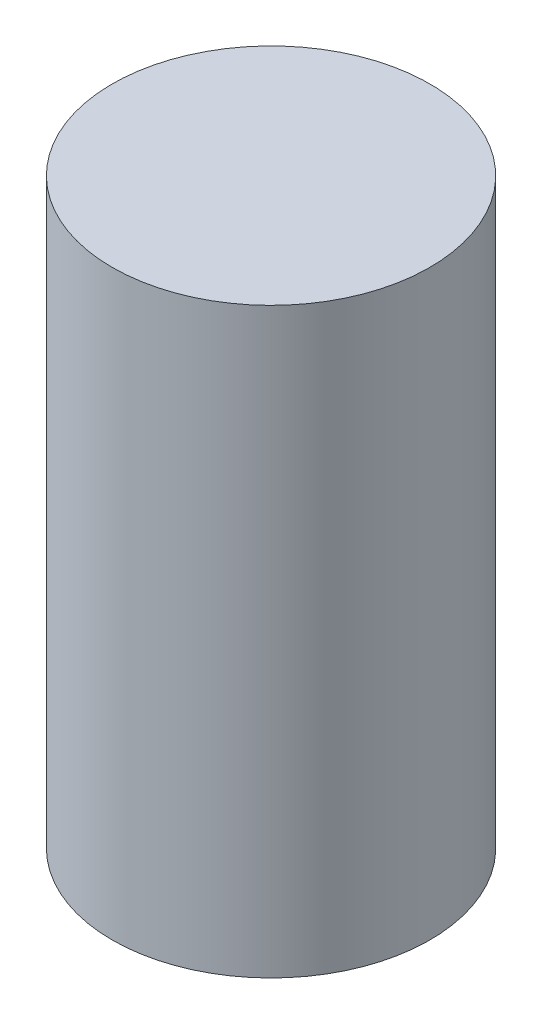
ISO-10303-21;
HEADER;
FILE_DESCRIPTION(('STEP AP214'),'2;1');
FILE_NAME('part.step','',(''),(''),'','','');
FILE_SCHEMA(('AUTOMOTIVE_DESIGN { 1 0 10303 214 1 1 1 1 }'));
ENDSEC;
DATA;
#1=APPLICATION_CONTEXT('core data for automotive mechanical design processes');
#2=APPLICATION_PROTOCOL_DEFINITION('international standard','automotive_design',2000,#1);
#3=PRODUCT_CONTEXT('',#1,'mechanical');
#4=PRODUCT('Part','Part','',(#3));
#5=PRODUCT_RELATED_PRODUCT_CATEGORY('part','',(#4));
#6=PRODUCT_DEFINITION_FORMATION('','',#4);
#7=PRODUCT_DEFINITION_CONTEXT('part definition',#1,'design');
#8=PRODUCT_DEFINITION('design','',#6,#7);
#9=PRODUCT_DEFINITION_SHAPE('','',#8);
#10=(LENGTH_UNIT() NAMED_UNIT(*) SI_UNIT(.MILLI.,.METRE.));
#11=(NAMED_UNIT(*) PLANE_ANGLE_UNIT() SI_UNIT($,.RADIAN.));
#12=(NAMED_UNIT(*) SI_UNIT($,.STERADIAN.) SOLID_ANGLE_UNIT());
#13=UNCERTAINTY_MEASURE_WITH_UNIT(LENGTH_MEASURE(1.E-05),#10,'distance_accuracy_value','');
#14=(GEOMETRIC_REPRESENTATION_CONTEXT(3) GLOBAL_UNCERTAINTY_ASSIGNED_CONTEXT((#13)) GLOBAL_UNIT_ASSIGNED_CONTEXT((#10,
#11,#12)) REPRESENTATION_CONTEXT('',''));
#15=CARTESIAN_POINT('',(0.,0.,0.));
#16=DIRECTION('',(0.,0.,1.));
#17=DIRECTION('',(1.,0.,0.));
#18=AXIS2_PLACEMENT_3D('',#15,#16,#17);
#19=CARTESIAN_POINT('',(0.,-100.,0.));
#20=DIRECTION('',(0.,1.,0.));
#21=DIRECTION('',(0.,0.,1.));
#22=AXIS2_PLACEMENT_3D('',#19,#20,#21);
#23=CYLINDRICAL_SURFACE('',#22,300.);
#24=CARTESIAN_POINT('',(0.,-100.,0.));
#25=DIRECTION('',(0.,1.,0.));
#26=DIRECTION('',(0.,0.,1.));
#27=AXIS2_PLACEMENT_3D('',#24,#25,#26);
#28=CIRCLE('',#27,300.);
#29=CARTESIAN_POINT('',(0.,-100.,300.));
#30=VERTEX_POINT('',#29);
#31=EDGE_CURVE('E10',#30,#30,#28,.T.);
#32=ORIENTED_EDGE('',*,*,#31,.T.);
#33=EDGE_LOOP('',(#32));
#34=FACE_BOUND('',#33,.T.);
#35=CARTESIAN_POINT('',(0.,1000.,0.));
#36=DIRECTION('',(0.,1.,0.));
#37=DIRECTION('',(0.,0.,1.));
#38=AXIS2_PLACEMENT_3D('',#35,#36,#37);
#39=CIRCLE('',#38,300.);
#40=CARTESIAN_POINT('',(0.,1000.,300.));
#41=VERTEX_POINT('',#40);
#42=EDGE_CURVE('E38',#41,#41,#39,.T.);
#43=ORIENTED_EDGE('',*,*,#42,.F.);
#44=EDGE_LOOP('',(#43));
#45=FACE_BOUND('',#44,.T.);
#46=ADVANCED_FACE('F32',(#34,#45),#23,.T.);
#47=CARTESIAN_POINT('',(0.,-100.,0.));
#48=DIRECTION('',(0.,1.,0.));
#49=DIRECTION('',(0.,0.,1.));
#50=AXIS2_PLACEMENT_3D('',#47,#48,#49);
#51=PLANE('',#50);
#52=ORIENTED_EDGE('',*,*,#31,.F.);
#53=EDGE_LOOP('',(#52));
#54=FACE_BOUND('',#53,.T.);
#55=ADVANCED_FACE('F47',(#54),#51,.F.);
#56=CARTESIAN_POINT('',(0.,1000.,0.));
#57=DIRECTION('',(0.,1.,0.));
#58=DIRECTION('',(0.,0.,1.));
#59=AXIS2_PLACEMENT_3D('',#56,#57,#58);
#60=PLANE('',#59);
#61=ORIENTED_EDGE('',*,*,#42,.T.);
#62=EDGE_LOOP('',(#61));
#63=FACE_BOUND('',#62,.T.);
#64=ADVANCED_FACE('F44',(#63),#60,.T.);
#65=CLOSED_SHELL('',(#46,#55,#64));
#66=MANIFOLD_SOLID_BREP('B2',#65);
#67=ADVANCED_BREP_SHAPE_REPRESENTATION('',(#18,#66),#14);
#68=SHAPE_DEFINITION_REPRESENTATION(#9,#67);
ENDSEC;
END-ISO-10303-21;
